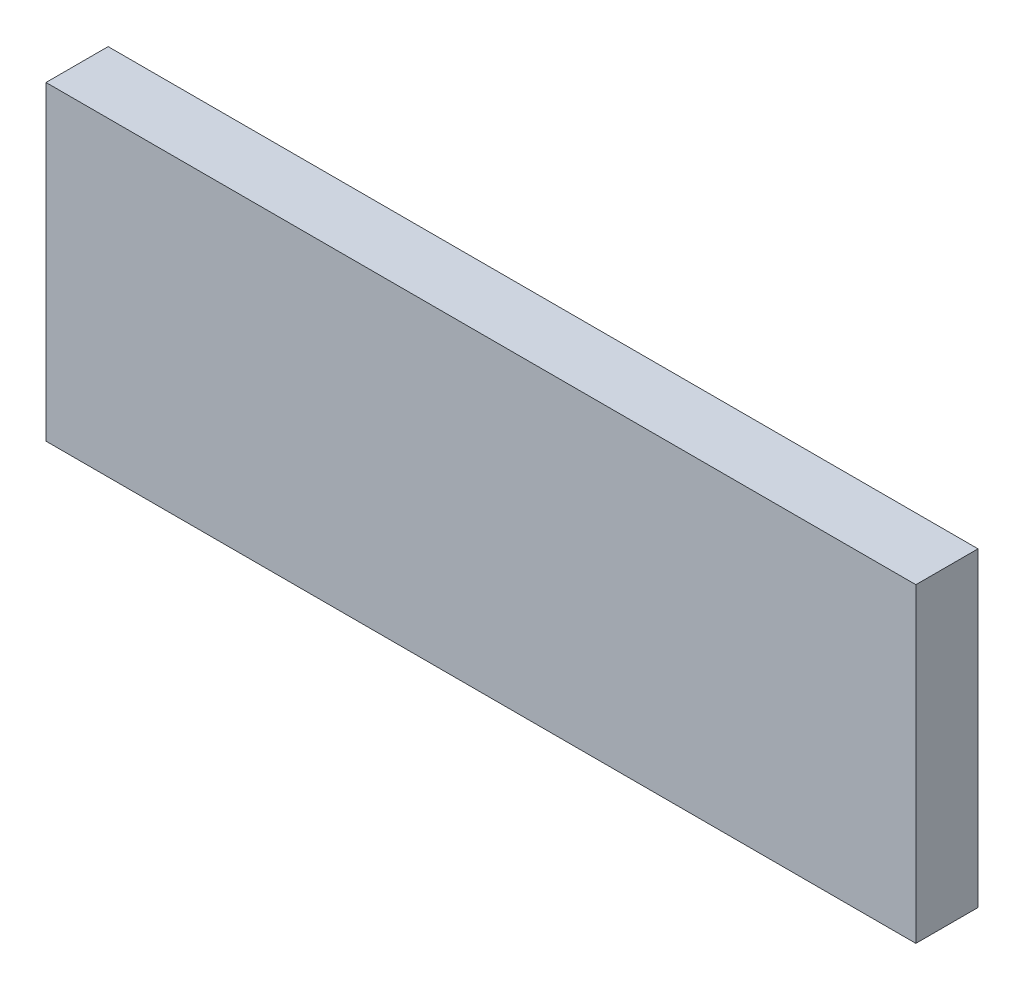
ISO-10303-21;
HEADER;
FILE_DESCRIPTION(('STEP AP214'),'2;1');
FILE_NAME('part.step','',(''),(''),'','','');
FILE_SCHEMA(('AUTOMOTIVE_DESIGN { 1 0 10303 214 1 1 1 1 }'));
ENDSEC;
DATA;
#1=APPLICATION_CONTEXT('core data for automotive mechanical design processes');
#2=APPLICATION_PROTOCOL_DEFINITION('international standard','automotive_design',2000,#1);
#3=PRODUCT_CONTEXT('',#1,'mechanical');
#4=PRODUCT('Part','Part','',(#3));
#5=PRODUCT_RELATED_PRODUCT_CATEGORY('part','',(#4));
#6=PRODUCT_DEFINITION_FORMATION('','',#4);
#7=PRODUCT_DEFINITION_CONTEXT('part definition',#1,'design');
#8=PRODUCT_DEFINITION('design','',#6,#7);
#9=PRODUCT_DEFINITION_SHAPE('','',#8);
#10=(LENGTH_UNIT() NAMED_UNIT(*) SI_UNIT(.MILLI.,.METRE.));
#11=(NAMED_UNIT(*) PLANE_ANGLE_UNIT() SI_UNIT($,.RADIAN.));
#12=(NAMED_UNIT(*) SI_UNIT($,.STERADIAN.) SOLID_ANGLE_UNIT());
#13=UNCERTAINTY_MEASURE_WITH_UNIT(LENGTH_MEASURE(1.E-05),#10,'distance_accuracy_value','');
#14=(GEOMETRIC_REPRESENTATION_CONTEXT(3) GLOBAL_UNCERTAINTY_ASSIGNED_CONTEXT((#13)) GLOBAL_UNIT_ASSIGNED_CONTEXT((#10,
#11,#12)) REPRESENTATION_CONTEXT('',''));
#15=CARTESIAN_POINT('',(0.,0.,0.));
#16=DIRECTION('',(0.,0.,1.));
#17=DIRECTION('',(1.,0.,0.));
#18=AXIS2_PLACEMENT_3D('',#15,#16,#17);
#19=CARTESIAN_POINT('',(0.,100.,0.));
#20=DIRECTION('',(1.,0.,0.));
#21=DIRECTION('',(0.,0.,-1.));
#22=AXIS2_PLACEMENT_3D('',#19,#20,#21);
#23=PLANE('',#22);
#24=DIRECTION('',(0.,0.,1.));
#25=VECTOR('',#24,1.);
#26=CARTESIAN_POINT('',(0.,0.,0.));
#27=LINE('',#26,#25);
#28=CARTESIAN_POINT('',(0.,0.,0.));
#29=VERTEX_POINT('',#28);
#30=CARTESIAN_POINT('',(0.,0.,20.));
#31=VERTEX_POINT('',#30);
#32=EDGE_CURVE('E107',#29,#31,#27,.T.);
#33=ORIENTED_EDGE('',*,*,#32,.T.);
#34=DIRECTION('',(0.,-1.,0.));
#35=VECTOR('',#34,1.);
#36=CARTESIAN_POINT('',(0.,100.,20.));
#37=LINE('',#36,#35);
#38=CARTESIAN_POINT('',(0.,100.,20.));
#39=VERTEX_POINT('',#38);
#40=EDGE_CURVE('E11',#39,#31,#37,.T.);
#41=ORIENTED_EDGE('',*,*,#40,.F.);
#42=DIRECTION('',(0.,0.,1.));
#43=VECTOR('',#42,1.);
#44=CARTESIAN_POINT('',(0.,100.,0.));
#45=LINE('',#44,#43);
#46=CARTESIAN_POINT('',(0.,100.,0.));
#47=VERTEX_POINT('',#46);
#48=EDGE_CURVE('E91',#47,#39,#45,.T.);
#49=ORIENTED_EDGE('',*,*,#48,.F.);
#50=DIRECTION('',(0.,-1.,0.));
#51=VECTOR('',#50,1.);
#52=CARTESIAN_POINT('',(0.,100.,0.));
#53=LINE('',#52,#51);
#54=EDGE_CURVE('E103',#47,#29,#53,.T.);
#55=ORIENTED_EDGE('',*,*,#54,.T.);
#56=EDGE_LOOP('',(#33,#41,#49,#55));
#57=FACE_BOUND('',#56,.T.);
#58=ADVANCED_FACE('F39',(#57),#23,.F.);
#59=CARTESIAN_POINT('',(0.,100.,20.));
#60=DIRECTION('',(0.,0.,-1.));
#61=DIRECTION('',(-1.,0.,0.));
#62=AXIS2_PLACEMENT_3D('',#59,#60,#61);
#63=PLANE('',#62);
#64=DIRECTION('',(1.,0.,0.));
#65=VECTOR('',#64,1.);
#66=CARTESIAN_POINT('',(0.,0.,20.));
#67=LINE('',#66,#65);
#68=CARTESIAN_POINT('',(280.,0.,20.));
#69=VERTEX_POINT('',#68);
#70=EDGE_CURVE('E96',#31,#69,#67,.T.);
#71=ORIENTED_EDGE('',*,*,#70,.T.);
#72=DIRECTION('',(0.,-1.,0.));
#73=VECTOR('',#72,1.);
#74=CARTESIAN_POINT('',(280.,100.,20.));
#75=LINE('',#74,#73);
#76=CARTESIAN_POINT('',(280.,100.,20.));
#77=VERTEX_POINT('',#76);
#78=EDGE_CURVE('E48',#77,#69,#75,.T.);
#79=ORIENTED_EDGE('',*,*,#78,.F.);
#80=DIRECTION('',(1.,0.,0.));
#81=VECTOR('',#80,1.);
#82=CARTESIAN_POINT('',(0.,100.,20.));
#83=LINE('',#82,#81);
#84=EDGE_CURVE('E86',#39,#77,#83,.T.);
#85=ORIENTED_EDGE('',*,*,#84,.F.);
#86=ORIENTED_EDGE('',*,*,#40,.T.);
#87=EDGE_LOOP('',(#71,#79,#85,#86));
#88=FACE_BOUND('',#87,.T.);
#89=ADVANCED_FACE('F95',(#88),#63,.F.);
#90=CARTESIAN_POINT('',(280.,100.,0.));
#91=DIRECTION('',(-1.,0.,0.));
#92=DIRECTION('',(0.,0.,1.));
#93=AXIS2_PLACEMENT_3D('',#90,#91,#92);
#94=PLANE('',#93);
#95=DIRECTION('',(0.,0.,-1.));
#96=VECTOR('',#95,1.);
#97=CARTESIAN_POINT('',(280.,0.,0.));
#98=LINE('',#97,#96);
#99=CARTESIAN_POINT('',(280.,0.,0.));
#100=VERTEX_POINT('',#99);
#101=EDGE_CURVE('E73',#69,#100,#98,.T.);
#102=ORIENTED_EDGE('',*,*,#101,.T.);
#103=DIRECTION('',(0.,-1.,0.));
#104=VECTOR('',#103,1.);
#105=CARTESIAN_POINT('',(280.,100.,0.));
#106=LINE('',#105,#104);
#107=CARTESIAN_POINT('',(280.,100.,0.));
#108=VERTEX_POINT('',#107);
#109=EDGE_CURVE('E98',#108,#100,#106,.T.);
#110=ORIENTED_EDGE('',*,*,#109,.F.);
#111=DIRECTION('',(0.,0.,-1.));
#112=VECTOR('',#111,1.);
#113=CARTESIAN_POINT('',(280.,100.,0.));
#114=LINE('',#113,#112);
#115=EDGE_CURVE('E89',#77,#108,#114,.T.);
#116=ORIENTED_EDGE('',*,*,#115,.F.);
#117=ORIENTED_EDGE('',*,*,#78,.T.);
#118=EDGE_LOOP('',(#102,#110,#116,#117));
#119=FACE_BOUND('',#118,.T.);
#120=ADVANCED_FACE('F99',(#119),#94,.F.);
#121=CARTESIAN_POINT('',(0.,100.,0.));
#122=DIRECTION('',(0.,0.,1.));
#123=DIRECTION('',(1.,0.,0.));
#124=AXIS2_PLACEMENT_3D('',#121,#122,#123);
#125=PLANE('',#124);
#126=DIRECTION('',(-1.,0.,0.));
#127=VECTOR('',#126,1.);
#128=CARTESIAN_POINT('',(0.,0.,0.));
#129=LINE('',#128,#127);
#130=EDGE_CURVE('E79',#100,#29,#129,.T.);
#131=ORIENTED_EDGE('',*,*,#130,.T.);
#132=ORIENTED_EDGE('',*,*,#54,.F.);
#133=DIRECTION('',(-1.,0.,0.));
#134=VECTOR('',#133,1.);
#135=CARTESIAN_POINT('',(0.,100.,0.));
#136=LINE('',#135,#134);
#137=EDGE_CURVE('E56',#108,#47,#136,.T.);
#138=ORIENTED_EDGE('',*,*,#137,.F.);
#139=ORIENTED_EDGE('',*,*,#109,.T.);
#140=EDGE_LOOP('',(#131,#132,#138,#139));
#141=FACE_BOUND('',#140,.T.);
#142=ADVANCED_FACE('F120',(#141),#125,.F.);
#143=CARTESIAN_POINT('',(0.,100.,0.));
#144=DIRECTION('',(0.,1.,0.));
#145=DIRECTION('',(0.,0.,1.));
#146=AXIS2_PLACEMENT_3D('',#143,#144,#145);
#147=PLANE('',#146);
#148=ORIENTED_EDGE('',*,*,#48,.T.);
#149=ORIENTED_EDGE('',*,*,#84,.T.);
#150=ORIENTED_EDGE('',*,*,#115,.T.);
#151=ORIENTED_EDGE('',*,*,#137,.T.);
#152=EDGE_LOOP('',(#148,#149,#150,#151));
#153=FACE_BOUND('',#152,.T.);
#154=ADVANCED_FACE('F87',(#153),#147,.T.);
#155=CARTESIAN_POINT('',(0.,0.,0.));
#156=DIRECTION('',(0.,1.,0.));
#157=DIRECTION('',(0.,0.,1.));
#158=AXIS2_PLACEMENT_3D('',#155,#156,#157);
#159=PLANE('',#158);
#160=ORIENTED_EDGE('',*,*,#32,.F.);
#161=ORIENTED_EDGE('',*,*,#130,.F.);
#162=ORIENTED_EDGE('',*,*,#101,.F.);
#163=ORIENTED_EDGE('',*,*,#70,.F.);
#164=EDGE_LOOP('',(#160,#161,#162,#163));
#165=FACE_BOUND('',#164,.T.);
#166=ADVANCED_FACE('F123',(#165),#159,.F.);
#167=CLOSED_SHELL('',(#58,#89,#120,#142,#154,#166));
#168=MANIFOLD_SOLID_BREP('B2',#167);
#169=ADVANCED_BREP_SHAPE_REPRESENTATION('',(#18,#168),#14);
#170=SHAPE_DEFINITION_REPRESENTATION(#9,#169);
ENDSEC;
END-ISO-10303-21;
